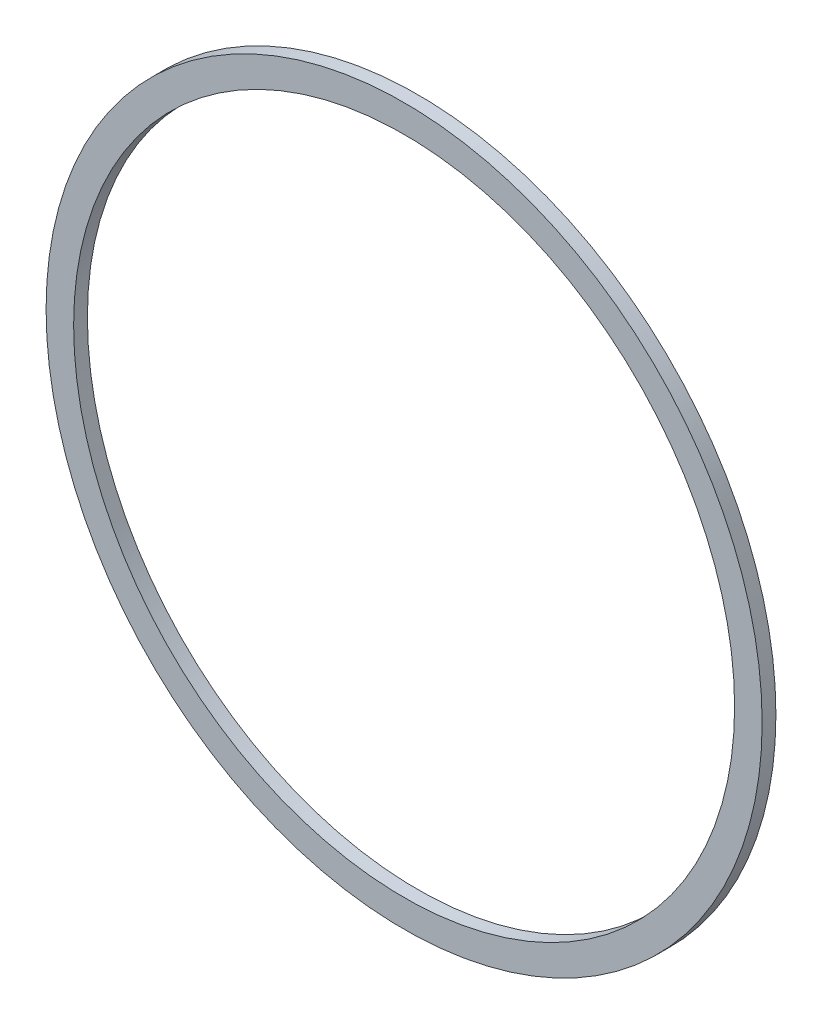
ISO-10303-21;
HEADER;
FILE_DESCRIPTION(('STEP AP214'),'2;1');
FILE_NAME('part.step','',(''),(''),'','','');
FILE_SCHEMA(('AUTOMOTIVE_DESIGN { 1 0 10303 214 1 1 1 1 }'));
ENDSEC;
DATA;
#1=APPLICATION_CONTEXT('core data for automotive mechanical design processes');
#2=APPLICATION_PROTOCOL_DEFINITION('international standard','automotive_design',2000,#1);
#3=PRODUCT_CONTEXT('',#1,'mechanical');
#4=PRODUCT('Part','Part','',(#3));
#5=PRODUCT_RELATED_PRODUCT_CATEGORY('part','',(#4));
#6=PRODUCT_DEFINITION_FORMATION('','',#4);
#7=PRODUCT_DEFINITION_CONTEXT('part definition',#1,'design');
#8=PRODUCT_DEFINITION('design','',#6,#7);
#9=PRODUCT_DEFINITION_SHAPE('','',#8);
#10=(LENGTH_UNIT() NAMED_UNIT(*) SI_UNIT(.MILLI.,.METRE.));
#11=(NAMED_UNIT(*) PLANE_ANGLE_UNIT() SI_UNIT($,.RADIAN.));
#12=(NAMED_UNIT(*) SI_UNIT($,.STERADIAN.) SOLID_ANGLE_UNIT());
#13=UNCERTAINTY_MEASURE_WITH_UNIT(LENGTH_MEASURE(1.E-05),#10,'distance_accuracy_value','');
#14=(GEOMETRIC_REPRESENTATION_CONTEXT(3) GLOBAL_UNCERTAINTY_ASSIGNED_CONTEXT((#13)) GLOBAL_UNIT_ASSIGNED_CONTEXT((#10,
#11,#12)) REPRESENTATION_CONTEXT('',''));
#15=CARTESIAN_POINT('',(0.,0.,0.));
#16=DIRECTION('',(0.,0.,1.));
#17=DIRECTION('',(1.,0.,0.));
#18=AXIS2_PLACEMENT_3D('',#15,#16,#17);
#19=CARTESIAN_POINT('',(0.,0.,1.));
#20=DIRECTION('',(0.,0.,1.));
#21=DIRECTION('',(1.,0.,0.));
#22=AXIS2_PLACEMENT_3D('',#19,#20,#21);
#23=PLANE('',#22);
#24=CARTESIAN_POINT('',(0.,0.,1.));
#25=DIRECTION('',(0.,0.,1.));
#26=DIRECTION('',(1.,0.,0.));
#27=AXIS2_PLACEMENT_3D('',#24,#25,#26);
#28=CIRCLE('',#27,26.);
#29=CARTESIAN_POINT('',(26.,0.,1.));
#30=VERTEX_POINT('',#29);
#31=EDGE_CURVE('E10',#30,#30,#28,.T.);
#32=ORIENTED_EDGE('',*,*,#31,.T.);
#33=EDGE_LOOP('',(#32));
#34=FACE_BOUND('',#33,.T.);
#35=CARTESIAN_POINT('',(0.,0.,1.));
#36=DIRECTION('',(0.,0.,1.));
#37=DIRECTION('',(1.,0.,0.));
#38=AXIS2_PLACEMENT_3D('',#35,#36,#37);
#39=CIRCLE('',#38,24.);
#40=CARTESIAN_POINT('',(24.,0.,1.));
#41=VERTEX_POINT('',#40);
#42=EDGE_CURVE('E41',#41,#41,#39,.T.);
#43=ORIENTED_EDGE('',*,*,#42,.F.);
#44=EDGE_LOOP('',(#43));
#45=FACE_BOUND('',#44,.T.);
#46=ADVANCED_FACE('F30',(#34,#45),#23,.T.);
#47=CARTESIAN_POINT('',(0.,0.,0.));
#48=DIRECTION('',(0.,0.,1.));
#49=DIRECTION('',(1.,0.,0.));
#50=AXIS2_PLACEMENT_3D('',#47,#48,#49);
#51=PLANE('',#50);
#52=CARTESIAN_POINT('',(0.,0.,0.));
#53=DIRECTION('',(0.,0.,1.));
#54=DIRECTION('',(1.,0.,0.));
#55=AXIS2_PLACEMENT_3D('',#52,#53,#54);
#56=CIRCLE('',#55,26.);
#57=CARTESIAN_POINT('',(26.,0.,0.));
#58=VERTEX_POINT('',#57);
#59=EDGE_CURVE('E37',#58,#58,#56,.T.);
#60=ORIENTED_EDGE('',*,*,#59,.F.);
#61=EDGE_LOOP('',(#60));
#62=FACE_BOUND('',#61,.T.);
#63=CARTESIAN_POINT('',(0.,0.,0.));
#64=DIRECTION('',(0.,0.,1.));
#65=DIRECTION('',(1.,0.,0.));
#66=AXIS2_PLACEMENT_3D('',#63,#64,#65);
#67=CIRCLE('',#66,24.);
#68=CARTESIAN_POINT('',(24.,0.,0.));
#69=VERTEX_POINT('',#68);
#70=EDGE_CURVE('E45',#69,#69,#67,.T.);
#71=ORIENTED_EDGE('',*,*,#70,.T.);
#72=EDGE_LOOP('',(#71));
#73=FACE_BOUND('',#72,.T.);
#74=ADVANCED_FACE('F51',(#62,#73),#51,.F.);
#75=CARTESIAN_POINT('',(0.,0.,1.));
#76=DIRECTION('',(0.,0.,-1.));
#77=DIRECTION('',(-1.,0.,0.));
#78=AXIS2_PLACEMENT_3D('',#75,#76,#77);
#79=CYLINDRICAL_SURFACE('',#78,26.);
#80=ORIENTED_EDGE('',*,*,#31,.F.);
#81=EDGE_LOOP('',(#80));
#82=FACE_BOUND('',#81,.T.);
#83=ORIENTED_EDGE('',*,*,#59,.T.);
#84=EDGE_LOOP('',(#83));
#85=FACE_BOUND('',#84,.T.);
#86=ADVANCED_FACE('F32',(#82,#85),#79,.T.);
#87=CARTESIAN_POINT('',(0.,0.,1.));
#88=DIRECTION('',(0.,0.,-1.));
#89=DIRECTION('',(-1.,0.,0.));
#90=AXIS2_PLACEMENT_3D('',#87,#88,#89);
#91=CYLINDRICAL_SURFACE('',#90,24.);
#92=ORIENTED_EDGE('',*,*,#42,.T.);
#93=EDGE_LOOP('',(#92));
#94=FACE_BOUND('',#93,.T.);
#95=ORIENTED_EDGE('',*,*,#70,.F.);
#96=EDGE_LOOP('',(#95));
#97=FACE_BOUND('',#96,.T.);
#98=ADVANCED_FACE('F53',(#94,#97),#91,.F.);
#99=CLOSED_SHELL('',(#46,#74,#86,#98));
#100=MANIFOLD_SOLID_BREP('B2',#99);
#101=ADVANCED_BREP_SHAPE_REPRESENTATION('',(#18,#100),#14);
#102=SHAPE_DEFINITION_REPRESENTATION(#9,#101);
ENDSEC;
END-ISO-10303-21;
